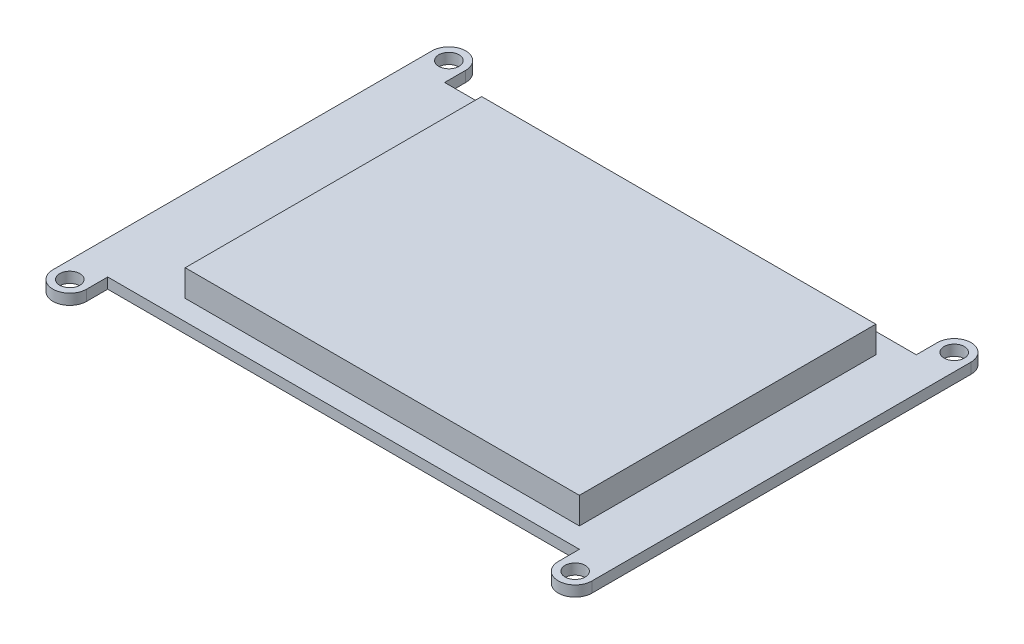
ISO-10303-21;
HEADER;
FILE_DESCRIPTION(('STEP AP214'),'2;1');
FILE_NAME('part.step','',(''),(''),'','','');
FILE_SCHEMA(('AUTOMOTIVE_DESIGN { 1 0 10303 214 1 1 1 1 }'));
ENDSEC;
DATA;
#1=APPLICATION_CONTEXT('core data for automotive mechanical design processes');
#2=APPLICATION_PROTOCOL_DEFINITION('international standard','automotive_design',2000,#1);
#3=PRODUCT_CONTEXT('',#1,'mechanical');
#4=PRODUCT('Part','Part','',(#3));
#5=PRODUCT_RELATED_PRODUCT_CATEGORY('part','',(#4));
#6=PRODUCT_DEFINITION_FORMATION('','',#4);
#7=PRODUCT_DEFINITION_CONTEXT('part definition',#1,'design');
#8=PRODUCT_DEFINITION('design','',#6,#7);
#9=PRODUCT_DEFINITION_SHAPE('','',#8);
#10=(LENGTH_UNIT() NAMED_UNIT(*) SI_UNIT(.MILLI.,.METRE.));
#11=(NAMED_UNIT(*) PLANE_ANGLE_UNIT() SI_UNIT($,.RADIAN.));
#12=(NAMED_UNIT(*) SI_UNIT($,.STERADIAN.) SOLID_ANGLE_UNIT());
#13=UNCERTAINTY_MEASURE_WITH_UNIT(LENGTH_MEASURE(1.E-05),#10,'distance_accuracy_value','');
#14=(GEOMETRIC_REPRESENTATION_CONTEXT(3) GLOBAL_UNCERTAINTY_ASSIGNED_CONTEXT((#13)) GLOBAL_UNIT_ASSIGNED_CONTEXT((#10,
#11,#12)) REPRESENTATION_CONTEXT('',''));
#15=CARTESIAN_POINT('',(0.,0.,0.));
#16=DIRECTION('',(0.,0.,1.));
#17=DIRECTION('',(1.,0.,0.));
#18=AXIS2_PLACEMENT_3D('',#15,#16,#17);
#19=CARTESIAN_POINT('',(0.,0.,0.));
#20=DIRECTION('',(0.,1.,0.));
#21=DIRECTION('',(0.,0.,1.));
#22=AXIS2_PLACEMENT_3D('',#19,#20,#21);
#23=PLANE('',#22);
#24=CARTESIAN_POINT('',(2.54,0.,-53.98));
#25=DIRECTION('',(0.,1.,0.));
#26=DIRECTION('',(0.,0.,1.));
#27=AXIS2_PLACEMENT_3D('',#24,#25,#26);
#28=CIRCLE('',#27,1.524);
#29=CARTESIAN_POINT('',(2.54,0.,-52.456));
#30=VERTEX_POINT('',#29);
#31=EDGE_CURVE('E317',#30,#30,#28,.T.);
#32=ORIENTED_EDGE('',*,*,#31,.T.);
#33=EDGE_LOOP('',(#32));
#34=FACE_BOUND('',#33,.T.);
#35=CARTESIAN_POINT('',(78.74,0.,-53.98));
#36=DIRECTION('',(0.,1.,0.));
#37=DIRECTION('',(0.,0.,1.));
#38=AXIS2_PLACEMENT_3D('',#35,#36,#37);
#39=CIRCLE('',#38,1.52400000000001);
#40=CARTESIAN_POINT('',(78.74,0.,-52.456));
#41=VERTEX_POINT('',#40);
#42=EDGE_CURVE('E292',#41,#41,#39,.T.);
#43=ORIENTED_EDGE('',*,*,#42,.T.);
#44=EDGE_LOOP('',(#43));
#45=FACE_BOUND('',#44,.T.);
#46=CARTESIAN_POINT('',(2.54,0.,3.18));
#47=DIRECTION('',(0.,1.,0.));
#48=DIRECTION('',(0.,0.,1.));
#49=AXIS2_PLACEMENT_3D('',#46,#47,#48);
#50=CIRCLE('',#49,1.524);
#51=CARTESIAN_POINT('',(2.54,0.,4.704));
#52=VERTEX_POINT('',#51);
#53=EDGE_CURVE('E262',#52,#52,#50,.T.);
#54=ORIENTED_EDGE('',*,*,#53,.T.);
#55=EDGE_LOOP('',(#54));
#56=FACE_BOUND('',#55,.T.);
#57=CARTESIAN_POINT('',(78.74,0.,3.18));
#58=DIRECTION('',(0.,1.,0.));
#59=DIRECTION('',(0.,0.,1.));
#60=AXIS2_PLACEMENT_3D('',#57,#58,#59);
#61=CIRCLE('',#60,1.52400000000001);
#62=CARTESIAN_POINT('',(78.74,0.,4.70400000000001));
#63=VERTEX_POINT('',#62);
#64=EDGE_CURVE('E237',#63,#63,#61,.T.);
#65=ORIENTED_EDGE('',*,*,#64,.T.);
#66=EDGE_LOOP('',(#65));
#67=FACE_BOUND('',#66,.T.);
#68=DIRECTION('',(0.,0.,1.));
#69=VECTOR('',#68,1.);
#70=CARTESIAN_POINT('',(66.1670000000001,0.,-1.08029598338784E-13));
#71=LINE('',#70,#69);
#72=CARTESIAN_POINT('',(66.167,0.,-50.8));
#73=VERTEX_POINT('',#72);
#74=CARTESIAN_POINT('',(66.167,0.,-33.8));
#75=VERTEX_POINT('',#74);
#76=EDGE_CURVE('E188',#73,#75,#71,.T.);
#77=ORIENTED_EDGE('',*,*,#76,.F.);
#78=DIRECTION('',(1.,0.,0.));
#79=VECTOR('',#78,1.);
#80=CARTESIAN_POINT('',(0.,0.,-50.8));
#81=LINE('',#80,#79);
#82=CARTESIAN_POINT('',(76.2,0.,-50.8));
#83=VERTEX_POINT('',#82);
#84=EDGE_CURVE('E355',#73,#83,#81,.T.);
#85=ORIENTED_EDGE('',*,*,#84,.T.);
#86=DIRECTION('',(0.,0.,-1.));
#87=VECTOR('',#86,1.);
#88=CARTESIAN_POINT('',(76.2,0.,0.));
#89=LINE('',#88,#87);
#90=CARTESIAN_POINT('',(76.2,0.,-53.98));
#91=VERTEX_POINT('',#90);
#92=EDGE_CURVE('E301',#83,#91,#89,.T.);
#93=ORIENTED_EDGE('',*,*,#92,.T.);
#94=CARTESIAN_POINT('',(78.74,0.,-53.98));
#95=DIRECTION('',(0.,1.,0.));
#96=DIRECTION('',(0.,0.,1.));
#97=AXIS2_PLACEMENT_3D('',#94,#95,#96);
#98=CIRCLE('',#97,2.54);
#99=CARTESIAN_POINT('',(81.28,0.,-53.98));
#100=VERTEX_POINT('',#99);
#101=EDGE_CURVE('E287',#91,#100,#98,.F.);
#102=ORIENTED_EDGE('',*,*,#101,.T.);
#103=DIRECTION('',(0.,0.,-1.));
#104=VECTOR('',#103,1.);
#105=CARTESIAN_POINT('',(81.28,0.,0.));
#106=LINE('',#105,#104);
#107=CARTESIAN_POINT('',(81.28,0.,3.18));
#108=VERTEX_POINT('',#107);
#109=EDGE_CURVE('E41',#108,#100,#106,.T.);
#110=ORIENTED_EDGE('',*,*,#109,.F.);
#111=CARTESIAN_POINT('',(78.74,0.,3.18));
#112=DIRECTION('',(0.,1.,0.));
#113=DIRECTION('',(0.,0.,1.));
#114=AXIS2_PLACEMENT_3D('',#111,#112,#113);
#115=CIRCLE('',#114,2.54);
#116=CARTESIAN_POINT('',(76.2,0.,3.18));
#117=VERTEX_POINT('',#116);
#118=EDGE_CURVE('E242',#117,#108,#115,.T.);
#119=ORIENTED_EDGE('',*,*,#118,.F.);
#120=DIRECTION('',(0.,0.,1.));
#121=VECTOR('',#120,1.);
#122=CARTESIAN_POINT('',(76.2,0.,0.));
#123=LINE('',#122,#121);
#124=CARTESIAN_POINT('',(76.2,0.,0.));
#125=VERTEX_POINT('',#124);
#126=EDGE_CURVE('E250',#125,#117,#123,.T.);
#127=ORIENTED_EDGE('',*,*,#126,.F.);
#128=DIRECTION('',(1.,0.,0.));
#129=VECTOR('',#128,1.);
#130=CARTESIAN_POINT('',(0.,0.,0.));
#131=LINE('',#130,#129);
#132=CARTESIAN_POINT('',(5.08,0.,0.));
#133=VERTEX_POINT('',#132);
#134=EDGE_CURVE('E356',#133,#125,#131,.T.);
#135=ORIENTED_EDGE('',*,*,#134,.F.);
#136=DIRECTION('',(0.,0.,1.));
#137=VECTOR('',#136,1.);
#138=CARTESIAN_POINT('',(5.08,0.,0.));
#139=LINE('',#138,#137);
#140=CARTESIAN_POINT('',(5.08,0.,3.18));
#141=VERTEX_POINT('',#140);
#142=EDGE_CURVE('E267',#133,#141,#139,.T.);
#143=ORIENTED_EDGE('',*,*,#142,.T.);
#144=CARTESIAN_POINT('',(2.54,0.,3.18));
#145=DIRECTION('',(0.,1.,0.));
#146=DIRECTION('',(0.,0.,1.));
#147=AXIS2_PLACEMENT_3D('',#144,#145,#146);
#148=CIRCLE('',#147,2.54);
#149=CARTESIAN_POINT('',(0.,0.,3.18));
#150=VERTEX_POINT('',#149);
#151=EDGE_CURVE('E275',#150,#141,#148,.T.);
#152=ORIENTED_EDGE('',*,*,#151,.F.);
#153=DIRECTION('',(0.,0.,-1.));
#154=VECTOR('',#153,1.);
#155=CARTESIAN_POINT('',(0.,0.,0.));
#156=LINE('',#155,#154);
#157=CARTESIAN_POINT('',(0.,0.,-53.98));
#158=VERTEX_POINT('',#157);
#159=EDGE_CURVE('E337',#150,#158,#156,.T.);
#160=ORIENTED_EDGE('',*,*,#159,.T.);
#161=CARTESIAN_POINT('',(2.54,0.,-53.98));
#162=DIRECTION('',(0.,1.,0.));
#163=DIRECTION('',(0.,0.,1.));
#164=AXIS2_PLACEMENT_3D('',#161,#162,#163);
#165=CIRCLE('',#164,2.54);
#166=CARTESIAN_POINT('',(5.08,0.,-53.98));
#167=VERTEX_POINT('',#166);
#168=EDGE_CURVE('E312',#158,#167,#165,.F.);
#169=ORIENTED_EDGE('',*,*,#168,.T.);
#170=DIRECTION('',(0.,0.,-1.));
#171=VECTOR('',#170,1.);
#172=CARTESIAN_POINT('',(5.08,0.,0.));
#173=LINE('',#172,#171);
#174=CARTESIAN_POINT('',(5.08,0.,-50.8));
#175=VERTEX_POINT('',#174);
#176=EDGE_CURVE('E325',#175,#167,#173,.T.);
#177=ORIENTED_EDGE('',*,*,#176,.F.);
#178=CARTESIAN_POINT('',(54.737,0.,-50.8));
#179=VERTEX_POINT('',#178);
#180=EDGE_CURVE('E346',#175,#179,#81,.T.);
#181=ORIENTED_EDGE('',*,*,#180,.T.);
#182=DIRECTION('',(0.,0.,1.));
#183=VECTOR('',#182,1.);
#184=CARTESIAN_POINT('',(54.7370000000001,0.,0.));
#185=LINE('',#184,#183);
#186=CARTESIAN_POINT('',(54.737,0.,-33.8));
#187=VERTEX_POINT('',#186);
#188=EDGE_CURVE('E194',#179,#187,#185,.T.);
#189=ORIENTED_EDGE('',*,*,#188,.T.);
#190=DIRECTION('',(-1.,0.,0.));
#191=VECTOR('',#190,1.);
#192=CARTESIAN_POINT('',(0.,0.,-33.8));
#193=LINE('',#192,#191);
#194=EDGE_CURVE('E54',#75,#187,#193,.T.);
#195=ORIENTED_EDGE('',*,*,#194,.F.);
#196=EDGE_LOOP('',(#77,#85,#93,#102,#110,#119,#127,#135,#143,#152,#160,#169,#177,#181,#189,#195));
#197=FACE_BOUND('',#196,.T.);
#198=ADVANCED_FACE('F37',(#34,#45,#56,#67,#197),#23,.F.);
#199=CARTESIAN_POINT('',(0.,1.6,0.));
#200=DIRECTION('',(0.,0.,-1.));
#201=DIRECTION('',(-1.,0.,0.));
#202=AXIS2_PLACEMENT_3D('',#199,#200,#201);
#203=PLANE('',#202);
#204=DIRECTION('',(0.,-1.,0.));
#205=VECTOR('',#204,1.);
#206=CARTESIAN_POINT('',(76.2,1.6,0.));
#207=LINE('',#206,#205);
#208=CARTESIAN_POINT('',(76.2,1.6,0.));
#209=VERTEX_POINT('',#208);
#210=EDGE_CURVE('E62',#209,#125,#207,.T.);
#211=ORIENTED_EDGE('',*,*,#210,.F.);
#212=DIRECTION('',(1.,0.,0.));
#213=VECTOR('',#212,1.);
#214=CARTESIAN_POINT('',(0.,1.6,0.));
#215=LINE('',#214,#213);
#216=CARTESIAN_POINT('',(5.08,1.6,0.));
#217=VERTEX_POINT('',#216);
#218=EDGE_CURVE('E345',#217,#209,#215,.T.);
#219=ORIENTED_EDGE('',*,*,#218,.F.);
#220=DIRECTION('',(0.,-1.,0.));
#221=VECTOR('',#220,1.);
#222=CARTESIAN_POINT('',(5.08,1.6,0.));
#223=LINE('',#222,#221);
#224=EDGE_CURVE('E272',#217,#133,#223,.T.);
#225=ORIENTED_EDGE('',*,*,#224,.T.);
#226=ORIENTED_EDGE('',*,*,#134,.T.);
#227=EDGE_LOOP('',(#211,#219,#225,#226));
#228=FACE_BOUND('',#227,.T.);
#229=ADVANCED_FACE('F392',(#228),#203,.F.);
#230=CARTESIAN_POINT('',(0.,1.6,0.));
#231=DIRECTION('',(-1.,0.,0.));
#232=DIRECTION('',(0.,0.,1.));
#233=AXIS2_PLACEMENT_3D('',#230,#231,#232);
#234=PLANE('',#233);
#235=ORIENTED_EDGE('',*,*,#159,.F.);
#236=DIRECTION('',(0.,-1.,0.));
#237=VECTOR('',#236,1.);
#238=CARTESIAN_POINT('',(0.,1.6,3.18));
#239=LINE('',#238,#237);
#240=CARTESIAN_POINT('',(0.,1.6,3.18));
#241=VERTEX_POINT('',#240);
#242=EDGE_CURVE('E284',#241,#150,#239,.T.);
#243=ORIENTED_EDGE('',*,*,#242,.F.);
#244=DIRECTION('',(0.,0.,-1.));
#245=VECTOR('',#244,1.);
#246=CARTESIAN_POINT('',(0.,1.6,0.));
#247=LINE('',#246,#245);
#248=CARTESIAN_POINT('',(0.,1.6,-53.98));
#249=VERTEX_POINT('',#248);
#250=EDGE_CURVE('E343',#241,#249,#247,.T.);
#251=ORIENTED_EDGE('',*,*,#250,.T.);
#252=DIRECTION('',(0.,-1.,0.));
#253=VECTOR('',#252,1.);
#254=CARTESIAN_POINT('',(0.,1.6,-53.98));
#255=LINE('',#254,#253);
#256=EDGE_CURVE('E334',#249,#158,#255,.T.);
#257=ORIENTED_EDGE('',*,*,#256,.T.);
#258=EDGE_LOOP('',(#235,#243,#251,#257));
#259=FACE_BOUND('',#258,.T.);
#260=ADVANCED_FACE('F39',(#259),#234,.T.);
#261=CARTESIAN_POINT('',(81.28,1.6,0.));
#262=DIRECTION('',(-1.,0.,0.));
#263=DIRECTION('',(0.,0.,1.));
#264=AXIS2_PLACEMENT_3D('',#261,#262,#263);
#265=PLANE('',#264);
#266=ORIENTED_EDGE('',*,*,#109,.T.);
#267=DIRECTION('',(0.,-1.,0.));
#268=VECTOR('',#267,1.);
#269=CARTESIAN_POINT('',(81.28,1.6,-53.98));
#270=LINE('',#269,#268);
#271=CARTESIAN_POINT('',(81.28,1.6,-53.98));
#272=VERTEX_POINT('',#271);
#273=EDGE_CURVE('E298',#272,#100,#270,.T.);
#274=ORIENTED_EDGE('',*,*,#273,.F.);
#275=DIRECTION('',(0.,0.,-1.));
#276=VECTOR('',#275,1.);
#277=CARTESIAN_POINT('',(81.28,1.6,0.));
#278=LINE('',#277,#276);
#279=CARTESIAN_POINT('',(81.28,1.6,3.18));
#280=VERTEX_POINT('',#279);
#281=EDGE_CURVE('E342',#280,#272,#278,.T.);
#282=ORIENTED_EDGE('',*,*,#281,.F.);
#283=DIRECTION('',(0.,-1.,0.));
#284=VECTOR('',#283,1.);
#285=CARTESIAN_POINT('',(81.28,1.6,3.18));
#286=LINE('',#285,#284);
#287=EDGE_CURVE('E256',#280,#108,#286,.T.);
#288=ORIENTED_EDGE('',*,*,#287,.T.);
#289=EDGE_LOOP('',(#266,#274,#282,#288));
#290=FACE_BOUND('',#289,.T.);
#291=ADVANCED_FACE('F400',(#290),#265,.F.);
#292=CARTESIAN_POINT('',(0.,1.6,-50.8));
#293=DIRECTION('',(0.,0.,-1.));
#294=DIRECTION('',(-1.,0.,0.));
#295=AXIS2_PLACEMENT_3D('',#292,#293,#294);
#296=PLANE('',#295);
#297=DIRECTION('',(0.,-1.,0.));
#298=VECTOR('',#297,1.);
#299=CARTESIAN_POINT('',(76.2,1.6,-50.8));
#300=LINE('',#299,#298);
#301=CARTESIAN_POINT('',(76.2,1.6,-50.8));
#302=VERTEX_POINT('',#301);
#303=EDGE_CURVE('E308',#302,#83,#300,.T.);
#304=ORIENTED_EDGE('',*,*,#303,.T.);
#305=ORIENTED_EDGE('',*,*,#84,.F.);
#306=DIRECTION('',(0.,1.,0.));
#307=VECTOR('',#306,1.);
#308=CARTESIAN_POINT('',(66.167,-2.,-50.8));
#309=LINE('',#308,#307);
#310=CARTESIAN_POINT('',(66.167,-2.,-50.8));
#311=VERTEX_POINT('',#310);
#312=EDGE_CURVE('E197',#311,#73,#309,.T.);
#313=ORIENTED_EDGE('',*,*,#312,.F.);
#314=DIRECTION('',(1.,0.,0.));
#315=VECTOR('',#314,1.);
#316=CARTESIAN_POINT('',(0.,-2.,-50.8));
#317=LINE('',#316,#315);
#318=CARTESIAN_POINT('',(54.737,-2.,-50.8));
#319=VERTEX_POINT('',#318);
#320=EDGE_CURVE('E183',#319,#311,#317,.T.);
#321=ORIENTED_EDGE('',*,*,#320,.F.);
#322=DIRECTION('',(0.,1.,0.));
#323=VECTOR('',#322,1.);
#324=CARTESIAN_POINT('',(54.737,-2.,-50.8));
#325=LINE('',#324,#323);
#326=EDGE_CURVE('E191',#319,#179,#325,.T.);
#327=ORIENTED_EDGE('',*,*,#326,.T.);
#328=ORIENTED_EDGE('',*,*,#180,.F.);
#329=DIRECTION('',(0.,-1.,0.));
#330=VECTOR('',#329,1.);
#331=CARTESIAN_POINT('',(5.08,1.6,-50.8));
#332=LINE('',#331,#330);
#333=CARTESIAN_POINT('',(5.08,1.6,-50.8));
#334=VERTEX_POINT('',#333);
#335=EDGE_CURVE('E331',#334,#175,#332,.T.);
#336=ORIENTED_EDGE('',*,*,#335,.F.);
#337=DIRECTION('',(1.,0.,0.));
#338=VECTOR('',#337,1.);
#339=CARTESIAN_POINT('',(0.,1.6,-50.8));
#340=LINE('',#339,#338);
#341=EDGE_CURVE('E338',#334,#302,#340,.T.);
#342=ORIENTED_EDGE('',*,*,#341,.T.);
#343=EDGE_LOOP('',(#304,#305,#313,#321,#327,#328,#336,#342));
#344=FACE_BOUND('',#343,.T.);
#345=ADVANCED_FACE('F200',(#344),#296,.T.);
#346=CARTESIAN_POINT('',(0.,1.6,0.));
#347=DIRECTION('',(0.,1.,0.));
#348=DIRECTION('',(0.,0.,1.));
#349=AXIS2_PLACEMENT_3D('',#346,#347,#348);
#350=PLANE('',#349);
#351=DIRECTION('',(0.,0.,1.));
#352=VECTOR('',#351,1.);
#353=CARTESIAN_POINT('',(13.716,1.6,0.));
#354=LINE('',#353,#352);
#355=CARTESIAN_POINT('',(13.716,1.6,-47.752));
#356=VERTEX_POINT('',#355);
#357=CARTESIAN_POINT('',(13.716,1.6,-3.048));
#358=VERTEX_POINT('',#357);
#359=EDGE_CURVE('E11',#356,#358,#354,.T.);
#360=ORIENTED_EDGE('',*,*,#359,.F.);
#361=DIRECTION('',(1.,0.,0.));
#362=VECTOR('',#361,1.);
#363=CARTESIAN_POINT('',(0.,1.6,-47.752));
#364=LINE('',#363,#362);
#365=CARTESIAN_POINT('',(73.152,1.6,-47.752));
#366=VERTEX_POINT('',#365);
#367=EDGE_CURVE('E341',#356,#366,#364,.T.);
#368=ORIENTED_EDGE('',*,*,#367,.T.);
#369=DIRECTION('',(0.,0.,1.));
#370=VECTOR('',#369,1.);
#371=CARTESIAN_POINT('',(73.152,1.6,0.));
#372=LINE('',#371,#370);
#373=CARTESIAN_POINT('',(73.152,1.6,-3.048));
#374=VERTEX_POINT('',#373);
#375=EDGE_CURVE('E350',#366,#374,#372,.T.);
#376=ORIENTED_EDGE('',*,*,#375,.T.);
#377=DIRECTION('',(1.,0.,0.));
#378=VECTOR('',#377,1.);
#379=CARTESIAN_POINT('',(0.,1.6,-3.048));
#380=LINE('',#379,#378);
#381=EDGE_CURVE('E46',#358,#374,#380,.T.);
#382=ORIENTED_EDGE('',*,*,#381,.F.);
#383=EDGE_LOOP('',(#360,#368,#376,#382));
#384=FACE_BOUND('',#383,.T.);
#385=ORIENTED_EDGE('',*,*,#341,.F.);
#386=DIRECTION('',(0.,0.,-1.));
#387=VECTOR('',#386,1.);
#388=CARTESIAN_POINT('',(5.08,1.6,0.));
#389=LINE('',#388,#387);
#390=CARTESIAN_POINT('',(5.08,1.6,-53.98));
#391=VERTEX_POINT('',#390);
#392=EDGE_CURVE('E316',#334,#391,#389,.T.);
#393=ORIENTED_EDGE('',*,*,#392,.T.);
#394=CARTESIAN_POINT('',(2.54,1.6,-53.98));
#395=DIRECTION('',(0.,1.,0.));
#396=DIRECTION('',(0.,0.,1.));
#397=AXIS2_PLACEMENT_3D('',#394,#395,#396);
#398=CIRCLE('',#397,2.54);
#399=EDGE_CURVE('E313',#249,#391,#398,.F.);
#400=ORIENTED_EDGE('',*,*,#399,.F.);
#401=ORIENTED_EDGE('',*,*,#250,.F.);
#402=CARTESIAN_POINT('',(2.54,1.6,3.18));
#403=DIRECTION('',(0.,1.,0.));
#404=DIRECTION('',(0.,0.,1.));
#405=AXIS2_PLACEMENT_3D('',#402,#403,#404);
#406=CIRCLE('',#405,2.54);
#407=CARTESIAN_POINT('',(5.08,1.6,3.18));
#408=VERTEX_POINT('',#407);
#409=EDGE_CURVE('E266',#241,#408,#406,.T.);
#410=ORIENTED_EDGE('',*,*,#409,.T.);
#411=DIRECTION('',(0.,0.,1.));
#412=VECTOR('',#411,1.);
#413=CARTESIAN_POINT('',(5.08,1.6,0.));
#414=LINE('',#413,#412);
#415=EDGE_CURVE('E269',#217,#408,#414,.T.);
#416=ORIENTED_EDGE('',*,*,#415,.F.);
#417=ORIENTED_EDGE('',*,*,#218,.T.);
#418=DIRECTION('',(0.,0.,1.));
#419=VECTOR('',#418,1.);
#420=CARTESIAN_POINT('',(76.2,1.6,0.));
#421=LINE('',#420,#419);
#422=CARTESIAN_POINT('',(76.2,1.6,3.18));
#423=VERTEX_POINT('',#422);
#424=EDGE_CURVE('E241',#209,#423,#421,.T.);
#425=ORIENTED_EDGE('',*,*,#424,.T.);
#426=CARTESIAN_POINT('',(78.74,1.6,3.18));
#427=DIRECTION('',(0.,1.,0.));
#428=DIRECTION('',(0.,0.,1.));
#429=AXIS2_PLACEMENT_3D('',#426,#427,#428);
#430=CIRCLE('',#429,2.54);
#431=EDGE_CURVE('E245',#423,#280,#430,.T.);
#432=ORIENTED_EDGE('',*,*,#431,.T.);
#433=ORIENTED_EDGE('',*,*,#281,.T.);
#434=CARTESIAN_POINT('',(78.74,1.6,-53.98));
#435=DIRECTION('',(0.,1.,0.));
#436=DIRECTION('',(0.,0.,1.));
#437=AXIS2_PLACEMENT_3D('',#434,#435,#436);
#438=CIRCLE('',#437,2.54);
#439=CARTESIAN_POINT('',(76.2,1.6,-53.98));
#440=VERTEX_POINT('',#439);
#441=EDGE_CURVE('E288',#440,#272,#438,.F.);
#442=ORIENTED_EDGE('',*,*,#441,.F.);
#443=DIRECTION('',(0.,0.,-1.));
#444=VECTOR('',#443,1.);
#445=CARTESIAN_POINT('',(76.2,1.6,0.));
#446=LINE('',#445,#444);
#447=EDGE_CURVE('E291',#302,#440,#446,.T.);
#448=ORIENTED_EDGE('',*,*,#447,.F.);
#449=EDGE_LOOP('',(#385,#393,#400,#401,#410,#416,#417,#425,#432,#433,#442,#448));
#450=FACE_BOUND('',#449,.T.);
#451=CARTESIAN_POINT('',(2.54,1.6,-53.98));
#452=DIRECTION('',(0.,1.,0.));
#453=DIRECTION('',(0.,0.,1.));
#454=AXIS2_PLACEMENT_3D('',#451,#452,#453);
#455=CIRCLE('',#454,1.524);
#456=CARTESIAN_POINT('',(2.54,1.6,-52.456));
#457=VERTEX_POINT('',#456);
#458=EDGE_CURVE('E319',#457,#457,#455,.T.);
#459=ORIENTED_EDGE('',*,*,#458,.F.);
#460=EDGE_LOOP('',(#459));
#461=FACE_BOUND('',#460,.T.);
#462=CARTESIAN_POINT('',(78.74,1.6,-53.98));
#463=DIRECTION('',(0.,1.,0.));
#464=DIRECTION('',(0.,0.,1.));
#465=AXIS2_PLACEMENT_3D('',#462,#463,#464);
#466=CIRCLE('',#465,1.52400000000001);
#467=CARTESIAN_POINT('',(78.74,1.6,-52.456));
#468=VERTEX_POINT('',#467);
#469=EDGE_CURVE('E295',#468,#468,#466,.T.);
#470=ORIENTED_EDGE('',*,*,#469,.F.);
#471=EDGE_LOOP('',(#470));
#472=FACE_BOUND('',#471,.T.);
#473=CARTESIAN_POINT('',(2.54,1.6,3.18));
#474=DIRECTION('',(0.,1.,0.));
#475=DIRECTION('',(0.,0.,1.));
#476=AXIS2_PLACEMENT_3D('',#473,#474,#475);
#477=CIRCLE('',#476,1.524);
#478=CARTESIAN_POINT('',(2.54,1.6,4.704));
#479=VERTEX_POINT('',#478);
#480=EDGE_CURVE('E263',#479,#479,#477,.T.);
#481=ORIENTED_EDGE('',*,*,#480,.F.);
#482=EDGE_LOOP('',(#481));
#483=FACE_BOUND('',#482,.T.);
#484=CARTESIAN_POINT('',(78.74,1.6,3.18));
#485=DIRECTION('',(0.,1.,0.));
#486=DIRECTION('',(0.,0.,1.));
#487=AXIS2_PLACEMENT_3D('',#484,#485,#486);
#488=CIRCLE('',#487,1.52400000000001);
#489=CARTESIAN_POINT('',(78.74,1.6,4.70400000000001));
#490=VERTEX_POINT('',#489);
#491=EDGE_CURVE('E238',#490,#490,#488,.T.);
#492=ORIENTED_EDGE('',*,*,#491,.F.);
#493=EDGE_LOOP('',(#492));
#494=FACE_BOUND('',#493,.T.);
#495=ADVANCED_FACE('F369',(#384,#450,#461,#472,#483,#494),#350,.T.);
#496=CARTESIAN_POINT('',(2.54,1.6,-53.98));
#497=DIRECTION('',(0.,-1.,0.));
#498=DIRECTION('',(0.,0.,-1.));
#499=AXIS2_PLACEMENT_3D('',#496,#497,#498);
#500=CYLINDRICAL_SURFACE('',#499,2.54);
#501=ORIENTED_EDGE('',*,*,#168,.F.);
#502=ORIENTED_EDGE('',*,*,#256,.F.);
#503=ORIENTED_EDGE('',*,*,#399,.T.);
#504=DIRECTION('',(0.,-1.,0.));
#505=VECTOR('',#504,1.);
#506=CARTESIAN_POINT('',(5.08,1.6,-53.98));
#507=LINE('',#506,#505);
#508=EDGE_CURVE('E322',#391,#167,#507,.T.);
#509=ORIENTED_EDGE('',*,*,#508,.T.);
#510=EDGE_LOOP('',(#501,#502,#503,#509));
#511=FACE_BOUND('',#510,.T.);
#512=ADVANCED_FACE('F380',(#511),#500,.T.);
#513=CARTESIAN_POINT('',(5.08,1.6,0.));
#514=DIRECTION('',(-1.,0.,0.));
#515=DIRECTION('',(0.,0.,1.));
#516=AXIS2_PLACEMENT_3D('',#513,#514,#515);
#517=PLANE('',#516);
#518=ORIENTED_EDGE('',*,*,#176,.T.);
#519=ORIENTED_EDGE('',*,*,#508,.F.);
#520=ORIENTED_EDGE('',*,*,#392,.F.);
#521=ORIENTED_EDGE('',*,*,#335,.T.);
#522=EDGE_LOOP('',(#518,#519,#520,#521));
#523=FACE_BOUND('',#522,.T.);
#524=ADVANCED_FACE('F375',(#523),#517,.F.);
#525=CARTESIAN_POINT('',(2.54,1.6,-53.98));
#526=DIRECTION('',(0.,-1.,0.));
#527=DIRECTION('',(0.,0.,-1.));
#528=AXIS2_PLACEMENT_3D('',#525,#526,#527);
#529=CYLINDRICAL_SURFACE('',#528,1.524);
#530=ORIENTED_EDGE('',*,*,#458,.T.);
#531=EDGE_LOOP('',(#530));
#532=FACE_BOUND('',#531,.T.);
#533=ORIENTED_EDGE('',*,*,#31,.F.);
#534=EDGE_LOOP('',(#533));
#535=FACE_BOUND('',#534,.T.);
#536=ADVANCED_FACE('F404',(#532,#535),#529,.F.);
#537=CARTESIAN_POINT('',(78.74,1.6,-53.98));
#538=DIRECTION('',(0.,-1.,0.));
#539=DIRECTION('',(0.,0.,-1.));
#540=AXIS2_PLACEMENT_3D('',#537,#538,#539);
#541=CYLINDRICAL_SURFACE('',#540,2.54);
#542=ORIENTED_EDGE('',*,*,#101,.F.);
#543=DIRECTION('',(0.,-1.,0.));
#544=VECTOR('',#543,1.);
#545=CARTESIAN_POINT('',(76.2,1.6,-53.98));
#546=LINE('',#545,#544);
#547=EDGE_CURVE('E310',#440,#91,#546,.T.);
#548=ORIENTED_EDGE('',*,*,#547,.F.);
#549=ORIENTED_EDGE('',*,*,#441,.T.);
#550=ORIENTED_EDGE('',*,*,#273,.T.);
#551=EDGE_LOOP('',(#542,#548,#549,#550));
#552=FACE_BOUND('',#551,.T.);
#553=ADVANCED_FACE('F402',(#552),#541,.T.);
#554=CARTESIAN_POINT('',(76.2,1.6,0.));
#555=DIRECTION('',(-1.,0.,0.));
#556=DIRECTION('',(0.,0.,1.));
#557=AXIS2_PLACEMENT_3D('',#554,#555,#556);
#558=PLANE('',#557);
#559=ORIENTED_EDGE('',*,*,#92,.F.);
#560=ORIENTED_EDGE('',*,*,#303,.F.);
#561=ORIENTED_EDGE('',*,*,#447,.T.);
#562=ORIENTED_EDGE('',*,*,#547,.T.);
#563=EDGE_LOOP('',(#559,#560,#561,#562));
#564=FACE_BOUND('',#563,.T.);
#565=ADVANCED_FACE('F363',(#564),#558,.T.);
#566=CARTESIAN_POINT('',(78.74,1.6,-53.98));
#567=DIRECTION('',(0.,-1.,0.));
#568=DIRECTION('',(0.,0.,-1.));
#569=AXIS2_PLACEMENT_3D('',#566,#567,#568);
#570=CYLINDRICAL_SURFACE('',#569,1.52400000000001);
#571=ORIENTED_EDGE('',*,*,#469,.T.);
#572=EDGE_LOOP('',(#571));
#573=FACE_BOUND('',#572,.T.);
#574=ORIENTED_EDGE('',*,*,#42,.F.);
#575=EDGE_LOOP('',(#574));
#576=FACE_BOUND('',#575,.T.);
#577=ADVANCED_FACE('F410',(#573,#576),#570,.F.);
#578=CARTESIAN_POINT('',(2.54,1.6,3.18));
#579=DIRECTION('',(0.,-1.,0.));
#580=DIRECTION('',(0.,0.,-1.));
#581=AXIS2_PLACEMENT_3D('',#578,#579,#580);
#582=CYLINDRICAL_SURFACE('',#581,2.54);
#583=ORIENTED_EDGE('',*,*,#151,.T.);
#584=DIRECTION('',(0.,-1.,0.));
#585=VECTOR('',#584,1.);
#586=CARTESIAN_POINT('',(5.08,1.6,3.18));
#587=LINE('',#586,#585);
#588=EDGE_CURVE('E282',#408,#141,#587,.T.);
#589=ORIENTED_EDGE('',*,*,#588,.F.);
#590=ORIENTED_EDGE('',*,*,#409,.F.);
#591=ORIENTED_EDGE('',*,*,#242,.T.);
#592=EDGE_LOOP('',(#583,#589,#590,#591));
#593=FACE_BOUND('',#592,.T.);
#594=ADVANCED_FACE('F387',(#593),#582,.T.);
#595=CARTESIAN_POINT('',(5.08,1.6,0.));
#596=DIRECTION('',(1.,0.,0.));
#597=DIRECTION('',(0.,0.,-1.));
#598=AXIS2_PLACEMENT_3D('',#595,#596,#597);
#599=PLANE('',#598);
#600=ORIENTED_EDGE('',*,*,#142,.F.);
#601=ORIENTED_EDGE('',*,*,#224,.F.);
#602=ORIENTED_EDGE('',*,*,#415,.T.);
#603=ORIENTED_EDGE('',*,*,#588,.T.);
#604=EDGE_LOOP('',(#600,#601,#602,#603));
#605=FACE_BOUND('',#604,.T.);
#606=ADVANCED_FACE('F391',(#605),#599,.T.);
#607=CARTESIAN_POINT('',(2.54,1.6,3.18));
#608=DIRECTION('',(0.,-1.,0.));
#609=DIRECTION('',(0.,0.,-1.));
#610=AXIS2_PLACEMENT_3D('',#607,#608,#609);
#611=CYLINDRICAL_SURFACE('',#610,1.524);
#612=ORIENTED_EDGE('',*,*,#480,.T.);
#613=EDGE_LOOP('',(#612));
#614=FACE_BOUND('',#613,.T.);
#615=ORIENTED_EDGE('',*,*,#53,.F.);
#616=EDGE_LOOP('',(#615));
#617=FACE_BOUND('',#616,.T.);
#618=ADVANCED_FACE('F445',(#614,#617),#611,.F.);
#619=CARTESIAN_POINT('',(76.2,1.6,0.));
#620=DIRECTION('',(1.,0.,0.));
#621=DIRECTION('',(0.,0.,-1.));
#622=AXIS2_PLACEMENT_3D('',#619,#620,#621);
#623=PLANE('',#622);
#624=ORIENTED_EDGE('',*,*,#126,.T.);
#625=DIRECTION('',(0.,-1.,0.));
#626=VECTOR('',#625,1.);
#627=CARTESIAN_POINT('',(76.2,1.6,3.18));
#628=LINE('',#627,#626);
#629=EDGE_CURVE('E259',#423,#117,#628,.T.);
#630=ORIENTED_EDGE('',*,*,#629,.F.);
#631=ORIENTED_EDGE('',*,*,#424,.F.);
#632=ORIENTED_EDGE('',*,*,#210,.T.);
#633=EDGE_LOOP('',(#624,#630,#631,#632));
#634=FACE_BOUND('',#633,.T.);
#635=ADVANCED_FACE('F396',(#634),#623,.F.);
#636=CARTESIAN_POINT('',(78.74,1.6,3.18));
#637=DIRECTION('',(0.,-1.,0.));
#638=DIRECTION('',(0.,0.,-1.));
#639=AXIS2_PLACEMENT_3D('',#636,#637,#638);
#640=CYLINDRICAL_SURFACE('',#639,2.54);
#641=ORIENTED_EDGE('',*,*,#118,.T.);
#642=ORIENTED_EDGE('',*,*,#287,.F.);
#643=ORIENTED_EDGE('',*,*,#431,.F.);
#644=ORIENTED_EDGE('',*,*,#629,.T.);
#645=EDGE_LOOP('',(#641,#642,#643,#644));
#646=FACE_BOUND('',#645,.T.);
#647=ADVANCED_FACE('F398',(#646),#640,.T.);
#648=CARTESIAN_POINT('',(78.74,1.6,3.18));
#649=DIRECTION('',(0.,-1.,0.));
#650=DIRECTION('',(0.,0.,-1.));
#651=AXIS2_PLACEMENT_3D('',#648,#649,#650);
#652=CYLINDRICAL_SURFACE('',#651,1.52400000000001);
#653=ORIENTED_EDGE('',*,*,#491,.T.);
#654=EDGE_LOOP('',(#653));
#655=FACE_BOUND('',#654,.T.);
#656=ORIENTED_EDGE('',*,*,#64,.F.);
#657=EDGE_LOOP('',(#656));
#658=FACE_BOUND('',#657,.T.);
#659=ADVANCED_FACE('F467',(#655,#658),#652,.F.);
#660=CARTESIAN_POINT('',(0.,5.6,-47.752));
#661=DIRECTION('',(0.,0.,-1.));
#662=DIRECTION('',(-1.,0.,0.));
#663=AXIS2_PLACEMENT_3D('',#660,#661,#662);
#664=PLANE('',#663);
#665=ORIENTED_EDGE('',*,*,#367,.F.);
#666=DIRECTION('',(0.,-1.,0.));
#667=VECTOR('',#666,1.);
#668=CARTESIAN_POINT('',(13.716,5.6,-47.752));
#669=LINE('',#668,#667);
#670=CARTESIAN_POINT('',(13.716,5.6,-47.752));
#671=VERTEX_POINT('',#670);
#672=EDGE_CURVE('E234',#671,#356,#669,.T.);
#673=ORIENTED_EDGE('',*,*,#672,.F.);
#674=DIRECTION('',(1.,0.,0.));
#675=VECTOR('',#674,1.);
#676=CARTESIAN_POINT('',(0.,5.6,-47.752));
#677=LINE('',#676,#675);
#678=CARTESIAN_POINT('',(73.152,5.6,-47.752));
#679=VERTEX_POINT('',#678);
#680=EDGE_CURVE('E215',#671,#679,#677,.T.);
#681=ORIENTED_EDGE('',*,*,#680,.T.);
#682=DIRECTION('',(0.,-1.,0.));
#683=VECTOR('',#682,1.);
#684=CARTESIAN_POINT('',(73.152,5.6,-47.752));
#685=LINE('',#684,#683);
#686=EDGE_CURVE('E225',#679,#366,#685,.T.);
#687=ORIENTED_EDGE('',*,*,#686,.T.);
#688=EDGE_LOOP('',(#665,#673,#681,#687));
#689=FACE_BOUND('',#688,.T.);
#690=ADVANCED_FACE('F476',(#689),#664,.T.);
#691=CARTESIAN_POINT('',(13.716,5.6,0.));
#692=DIRECTION('',(1.,0.,0.));
#693=DIRECTION('',(0.,0.,-1.));
#694=AXIS2_PLACEMENT_3D('',#691,#692,#693);
#695=PLANE('',#694);
#696=ORIENTED_EDGE('',*,*,#359,.T.);
#697=DIRECTION('',(0.,-1.,0.));
#698=VECTOR('',#697,1.);
#699=CARTESIAN_POINT('',(13.716,5.6,-3.048));
#700=LINE('',#699,#698);
#701=CARTESIAN_POINT('',(13.716,5.6,-3.048));
#702=VERTEX_POINT('',#701);
#703=EDGE_CURVE('E231',#702,#358,#700,.T.);
#704=ORIENTED_EDGE('',*,*,#703,.F.);
#705=DIRECTION('',(0.,0.,1.));
#706=VECTOR('',#705,1.);
#707=CARTESIAN_POINT('',(13.716,5.6,0.));
#708=LINE('',#707,#706);
#709=EDGE_CURVE('E218',#671,#702,#708,.T.);
#710=ORIENTED_EDGE('',*,*,#709,.F.);
#711=ORIENTED_EDGE('',*,*,#672,.T.);
#712=EDGE_LOOP('',(#696,#704,#710,#711));
#713=FACE_BOUND('',#712,.T.);
#714=ADVANCED_FACE('F484',(#713),#695,.F.);
#715=CARTESIAN_POINT('',(0.,5.6,-3.048));
#716=DIRECTION('',(0.,0.,-1.));
#717=DIRECTION('',(-1.,0.,0.));
#718=AXIS2_PLACEMENT_3D('',#715,#716,#717);
#719=PLANE('',#718);
#720=ORIENTED_EDGE('',*,*,#381,.T.);
#721=DIRECTION('',(0.,-1.,0.));
#722=VECTOR('',#721,1.);
#723=CARTESIAN_POINT('',(73.152,5.6,-3.048));
#724=LINE('',#723,#722);
#725=CARTESIAN_POINT('',(73.152,5.6,-3.048));
#726=VERTEX_POINT('',#725);
#727=EDGE_CURVE('E228',#726,#374,#724,.T.);
#728=ORIENTED_EDGE('',*,*,#727,.F.);
#729=DIRECTION('',(1.,0.,0.));
#730=VECTOR('',#729,1.);
#731=CARTESIAN_POINT('',(0.,5.6,-3.048));
#732=LINE('',#731,#730);
#733=EDGE_CURVE('E220',#702,#726,#732,.T.);
#734=ORIENTED_EDGE('',*,*,#733,.F.);
#735=ORIENTED_EDGE('',*,*,#703,.T.);
#736=EDGE_LOOP('',(#720,#728,#734,#735));
#737=FACE_BOUND('',#736,.T.);
#738=ADVANCED_FACE('F489',(#737),#719,.F.);
#739=CARTESIAN_POINT('',(73.152,5.6,0.));
#740=DIRECTION('',(1.,0.,0.));
#741=DIRECTION('',(0.,0.,-1.));
#742=AXIS2_PLACEMENT_3D('',#739,#740,#741);
#743=PLANE('',#742);
#744=ORIENTED_EDGE('',*,*,#727,.T.);
#745=ORIENTED_EDGE('',*,*,#375,.F.);
#746=ORIENTED_EDGE('',*,*,#686,.F.);
#747=DIRECTION('',(0.,0.,1.));
#748=VECTOR('',#747,1.);
#749=CARTESIAN_POINT('',(73.152,5.6,0.));
#750=LINE('',#749,#748);
#751=EDGE_CURVE('E222',#679,#726,#750,.T.);
#752=ORIENTED_EDGE('',*,*,#751,.T.);
#753=EDGE_LOOP('',(#744,#745,#746,#752));
#754=FACE_BOUND('',#753,.T.);
#755=ADVANCED_FACE('F499',(#754),#743,.T.);
#756=CARTESIAN_POINT('',(0.,5.6,0.));
#757=DIRECTION('',(0.,1.,0.));
#758=DIRECTION('',(0.,0.,1.));
#759=AXIS2_PLACEMENT_3D('',#756,#757,#758);
#760=PLANE('',#759);
#761=ORIENTED_EDGE('',*,*,#751,.F.);
#762=ORIENTED_EDGE('',*,*,#680,.F.);
#763=ORIENTED_EDGE('',*,*,#709,.T.);
#764=ORIENTED_EDGE('',*,*,#733,.T.);
#765=EDGE_LOOP('',(#761,#762,#763,#764));
#766=FACE_BOUND('',#765,.T.);
#767=ADVANCED_FACE('F509',(#766),#760,.T.);
#768=CARTESIAN_POINT('',(66.1670000000001,-2.,-1.08029598338784E-13));
#769=DIRECTION('',(-1.,0.,0.));
#770=DIRECTION('',(0.,0.,1.));
#771=AXIS2_PLACEMENT_3D('',#768,#769,#770);
#772=PLANE('',#771);
#773=ORIENTED_EDGE('',*,*,#76,.T.);
#774=DIRECTION('',(0.,1.,0.));
#775=VECTOR('',#774,1.);
#776=CARTESIAN_POINT('',(66.167,-2.,-33.8));
#777=LINE('',#776,#775);
#778=CARTESIAN_POINT('',(66.167,-2.,-33.8));
#779=VERTEX_POINT('',#778);
#780=EDGE_CURVE('E213',#779,#75,#777,.T.);
#781=ORIENTED_EDGE('',*,*,#780,.F.);
#782=DIRECTION('',(0.,0.,1.));
#783=VECTOR('',#782,1.);
#784=CARTESIAN_POINT('',(66.1670000000001,-2.,-1.08029598338784E-13));
#785=LINE('',#784,#783);
#786=EDGE_CURVE('E207',#311,#779,#785,.T.);
#787=ORIENTED_EDGE('',*,*,#786,.F.);
#788=ORIENTED_EDGE('',*,*,#312,.T.);
#789=EDGE_LOOP('',(#773,#781,#787,#788));
#790=FACE_BOUND('',#789,.T.);
#791=ADVANCED_FACE('F520',(#790),#772,.F.);
#792=CARTESIAN_POINT('',(0.,-2.,-33.8));
#793=DIRECTION('',(0.,0.,-1.));
#794=DIRECTION('',(-1.,0.,0.));
#795=AXIS2_PLACEMENT_3D('',#792,#793,#794);
#796=PLANE('',#795);
#797=ORIENTED_EDGE('',*,*,#194,.T.);
#798=DIRECTION('',(0.,1.,0.));
#799=VECTOR('',#798,1.);
#800=CARTESIAN_POINT('',(54.737,-2.,-33.8));
#801=LINE('',#800,#799);
#802=CARTESIAN_POINT('',(54.737,-2.,-33.8));
#803=VERTEX_POINT('',#802);
#804=EDGE_CURVE('E209',#803,#187,#801,.T.);
#805=ORIENTED_EDGE('',*,*,#804,.F.);
#806=DIRECTION('',(-1.,0.,0.));
#807=VECTOR('',#806,1.);
#808=CARTESIAN_POINT('',(0.,-2.,-33.8));
#809=LINE('',#808,#807);
#810=EDGE_CURVE('E186',#779,#803,#809,.T.);
#811=ORIENTED_EDGE('',*,*,#810,.F.);
#812=ORIENTED_EDGE('',*,*,#780,.T.);
#813=EDGE_LOOP('',(#797,#805,#811,#812));
#814=FACE_BOUND('',#813,.T.);
#815=ADVANCED_FACE('F548',(#814),#796,.F.);
#816=CARTESIAN_POINT('',(54.7370000000001,-2.,0.));
#817=DIRECTION('',(-1.,0.,0.));
#818=DIRECTION('',(0.,0.,1.));
#819=AXIS2_PLACEMENT_3D('',#816,#817,#818);
#820=PLANE('',#819);
#821=ORIENTED_EDGE('',*,*,#188,.F.);
#822=ORIENTED_EDGE('',*,*,#326,.F.);
#823=DIRECTION('',(0.,0.,1.));
#824=VECTOR('',#823,1.);
#825=CARTESIAN_POINT('',(54.7370000000001,-2.,0.));
#826=LINE('',#825,#824);
#827=EDGE_CURVE('E179',#319,#803,#826,.T.);
#828=ORIENTED_EDGE('',*,*,#827,.T.);
#829=ORIENTED_EDGE('',*,*,#804,.T.);
#830=EDGE_LOOP('',(#821,#822,#828,#829));
#831=FACE_BOUND('',#830,.T.);
#832=ADVANCED_FACE('F192',(#831),#820,.T.);
#833=CARTESIAN_POINT('',(0.,-2.,0.));
#834=DIRECTION('',(0.,1.,0.));
#835=DIRECTION('',(0.,0.,1.));
#836=AXIS2_PLACEMENT_3D('',#833,#834,#835);
#837=PLANE('',#836);
#838=ORIENTED_EDGE('',*,*,#827,.F.);
#839=ORIENTED_EDGE('',*,*,#320,.T.);
#840=ORIENTED_EDGE('',*,*,#786,.T.);
#841=ORIENTED_EDGE('',*,*,#810,.T.);
#842=EDGE_LOOP('',(#838,#839,#840,#841));
#843=FACE_BOUND('',#842,.T.);
#844=ADVANCED_FACE('F181',(#843),#837,.F.);
#845=CLOSED_SHELL('',(#198,#229,#260,#291,#345,#495,#512,#524,#536,#553,#565,#577,#594,#606,
#618,#635,#647,#659,#690,#714,#738,#755,#767,#791,#815,#832,#844));
#846=MANIFOLD_SOLID_BREP('B2',#845);
#847=ADVANCED_BREP_SHAPE_REPRESENTATION('',(#18,#846),#14);
#848=SHAPE_DEFINITION_REPRESENTATION(#9,#847);
ENDSEC;
END-ISO-10303-21;
